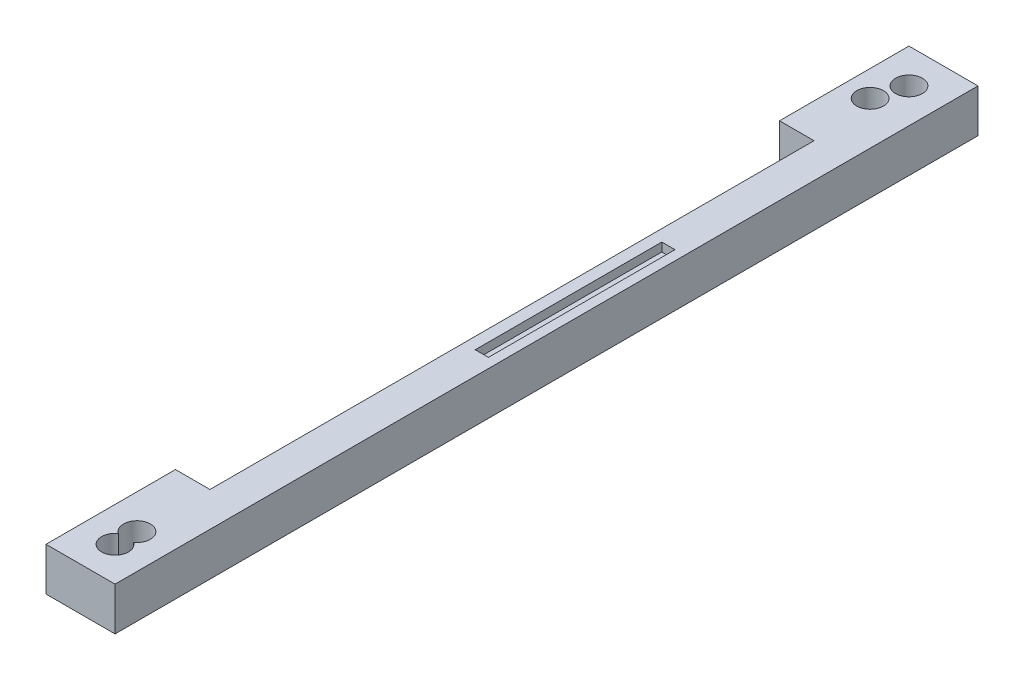
ISO-10303-21;
HEADER;
FILE_DESCRIPTION(('STEP AP214'),'2;1');
FILE_NAME('part.step','',(''),(''),'','','');
FILE_SCHEMA(('AUTOMOTIVE_DESIGN { 1 0 10303 214 1 1 1 1 }'));
ENDSEC;
DATA;
#1=APPLICATION_CONTEXT('core data for automotive mechanical design processes');
#2=APPLICATION_PROTOCOL_DEFINITION('international standard','automotive_design',2000,#1);
#3=PRODUCT_CONTEXT('',#1,'mechanical');
#4=PRODUCT('Part','Part','',(#3));
#5=PRODUCT_RELATED_PRODUCT_CATEGORY('part','',(#4));
#6=PRODUCT_DEFINITION_FORMATION('','',#4);
#7=PRODUCT_DEFINITION_CONTEXT('part definition',#1,'design');
#8=PRODUCT_DEFINITION('design','',#6,#7);
#9=PRODUCT_DEFINITION_SHAPE('','',#8);
#10=(LENGTH_UNIT() NAMED_UNIT(*) SI_UNIT(.MILLI.,.METRE.));
#11=(NAMED_UNIT(*) PLANE_ANGLE_UNIT() SI_UNIT($,.RADIAN.));
#12=(NAMED_UNIT(*) SI_UNIT($,.STERADIAN.) SOLID_ANGLE_UNIT());
#13=UNCERTAINTY_MEASURE_WITH_UNIT(LENGTH_MEASURE(1.E-05),#10,'distance_accuracy_value','');
#14=(GEOMETRIC_REPRESENTATION_CONTEXT(3) GLOBAL_UNCERTAINTY_ASSIGNED_CONTEXT((#13)) GLOBAL_UNIT_ASSIGNED_CONTEXT((#10,
#11,#12)) REPRESENTATION_CONTEXT('',''));
#15=CARTESIAN_POINT('',(0.,0.,0.));
#16=DIRECTION('',(0.,0.,1.));
#17=DIRECTION('',(1.,0.,0.));
#18=AXIS2_PLACEMENT_3D('',#15,#16,#17);
#19=CARTESIAN_POINT('',(-4.,5.,50.));
#20=DIRECTION('',(1.,0.,0.));
#21=DIRECTION('',(0.,0.,-1.));
#22=AXIS2_PLACEMENT_3D('',#19,#20,#21);
#23=PLANE('',#22);
#24=DIRECTION('',(0.,0.,1.));
#25=VECTOR('',#24,1.);
#26=CARTESIAN_POINT('',(-4.,0.,50.));
#27=LINE('',#26,#25);
#28=CARTESIAN_POINT('',(-4.,0.,-50.));
#29=VERTEX_POINT('',#28);
#30=CARTESIAN_POINT('',(-4.,0.,-35.));
#31=VERTEX_POINT('',#30);
#32=EDGE_CURVE('E269',#29,#31,#27,.T.);
#33=ORIENTED_EDGE('',*,*,#32,.T.);
#34=DIRECTION('',(0.,1.,0.));
#35=VECTOR('',#34,1.);
#36=CARTESIAN_POINT('',(-4.,0.,-35.));
#37=LINE('',#36,#35);
#38=CARTESIAN_POINT('',(-4.,5.,-35.));
#39=VERTEX_POINT('',#38);
#40=EDGE_CURVE('E206',#31,#39,#37,.T.);
#41=ORIENTED_EDGE('',*,*,#40,.T.);
#42=DIRECTION('',(0.,0.,1.));
#43=VECTOR('',#42,1.);
#44=CARTESIAN_POINT('',(-4.,5.,50.));
#45=LINE('',#44,#43);
#46=CARTESIAN_POINT('',(-4.,5.,-50.));
#47=VERTEX_POINT('',#46);
#48=EDGE_CURVE('E256',#47,#39,#45,.T.);
#49=ORIENTED_EDGE('',*,*,#48,.F.);
#50=DIRECTION('',(0.,-1.,0.));
#51=VECTOR('',#50,1.);
#52=CARTESIAN_POINT('',(-4.,5.,-50.));
#53=LINE('',#52,#51);
#54=EDGE_CURVE('E57',#47,#29,#53,.T.);
#55=ORIENTED_EDGE('',*,*,#54,.T.);
#56=EDGE_LOOP('',(#33,#41,#49,#55));
#57=FACE_BOUND('',#56,.T.);
#58=ADVANCED_FACE('F48',(#57),#23,.F.);
#59=CARTESIAN_POINT('',(4.,5.,50.));
#60=DIRECTION('',(-1.,0.,0.));
#61=DIRECTION('',(0.,0.,1.));
#62=AXIS2_PLACEMENT_3D('',#59,#60,#61);
#63=PLANE('',#62);
#64=DIRECTION('',(0.,0.,-1.));
#65=VECTOR('',#64,1.);
#66=CARTESIAN_POINT('',(4.,0.,50.));
#67=LINE('',#66,#65);
#68=CARTESIAN_POINT('',(4.,0.,50.));
#69=VERTEX_POINT('',#68);
#70=CARTESIAN_POINT('',(4.,0.,-50.));
#71=VERTEX_POINT('',#70);
#72=EDGE_CURVE('E244',#69,#71,#67,.T.);
#73=ORIENTED_EDGE('',*,*,#72,.T.);
#74=DIRECTION('',(0.,-1.,0.));
#75=VECTOR('',#74,1.);
#76=CARTESIAN_POINT('',(4.,5.,-50.));
#77=LINE('',#76,#75);
#78=CARTESIAN_POINT('',(4.,5.,-50.));
#79=VERTEX_POINT('',#78);
#80=EDGE_CURVE('E12',#79,#71,#77,.T.);
#81=ORIENTED_EDGE('',*,*,#80,.F.);
#82=DIRECTION('',(0.,0.,-1.));
#83=VECTOR('',#82,1.);
#84=CARTESIAN_POINT('',(4.,5.,50.));
#85=LINE('',#84,#83);
#86=CARTESIAN_POINT('',(4.,5.,50.));
#87=VERTEX_POINT('',#86);
#88=EDGE_CURVE('E247',#87,#79,#85,.T.);
#89=ORIENTED_EDGE('',*,*,#88,.F.);
#90=DIRECTION('',(0.,-1.,0.));
#91=VECTOR('',#90,1.);
#92=CARTESIAN_POINT('',(4.,5.,50.));
#93=LINE('',#92,#91);
#94=EDGE_CURVE('E261',#87,#69,#93,.T.);
#95=ORIENTED_EDGE('',*,*,#94,.T.);
#96=EDGE_LOOP('',(#73,#81,#89,#95));
#97=FACE_BOUND('',#96,.T.);
#98=ADVANCED_FACE('F50',(#97),#63,.F.);
#99=CARTESIAN_POINT('',(-4.,5.,-50.));
#100=DIRECTION('',(0.,0.,1.));
#101=DIRECTION('',(1.,0.,0.));
#102=AXIS2_PLACEMENT_3D('',#99,#100,#101);
#103=PLANE('',#102);
#104=DIRECTION('',(-1.,0.,0.));
#105=VECTOR('',#104,1.);
#106=CARTESIAN_POINT('',(-4.,0.,-50.));
#107=LINE('',#106,#105);
#108=EDGE_CURVE('E265',#71,#29,#107,.T.);
#109=ORIENTED_EDGE('',*,*,#108,.T.);
#110=ORIENTED_EDGE('',*,*,#54,.F.);
#111=DIRECTION('',(-1.,0.,0.));
#112=VECTOR('',#111,1.);
#113=CARTESIAN_POINT('',(-4.,5.,-50.));
#114=LINE('',#113,#112);
#115=EDGE_CURVE('E251',#79,#47,#114,.T.);
#116=ORIENTED_EDGE('',*,*,#115,.F.);
#117=ORIENTED_EDGE('',*,*,#80,.T.);
#118=EDGE_LOOP('',(#109,#110,#116,#117));
#119=FACE_BOUND('',#118,.T.);
#120=ADVANCED_FACE('F296',(#119),#103,.F.);
#121=CARTESIAN_POINT('',(-3.99999999999999,5.,35.));
#122=VERTEX_POINT('',#121);
#123=CARTESIAN_POINT('',(-4.,5.,50.));
#124=VERTEX_POINT('',#123);
#125=EDGE_CURVE('E255',#122,#124,#45,.T.);
#126=ORIENTED_EDGE('',*,*,#125,.F.);
#127=DIRECTION('',(0.,1.,0.));
#128=VECTOR('',#127,1.);
#129=CARTESIAN_POINT('',(-3.99999999999999,0.,35.));
#130=LINE('',#129,#128);
#131=CARTESIAN_POINT('',(-3.99999999999999,0.,35.));
#132=VERTEX_POINT('',#131);
#133=EDGE_CURVE('E199',#132,#122,#130,.T.);
#134=ORIENTED_EDGE('',*,*,#133,.F.);
#135=CARTESIAN_POINT('',(-4.,0.,50.));
#136=VERTEX_POINT('',#135);
#137=EDGE_CURVE('E268',#132,#136,#27,.T.);
#138=ORIENTED_EDGE('',*,*,#137,.T.);
#139=DIRECTION('',(0.,-1.,0.));
#140=VECTOR('',#139,1.);
#141=CARTESIAN_POINT('',(-4.,5.,50.));
#142=LINE('',#141,#140);
#143=EDGE_CURVE('E275',#124,#136,#142,.T.);
#144=ORIENTED_EDGE('',*,*,#143,.F.);
#145=EDGE_LOOP('',(#126,#134,#138,#144));
#146=FACE_BOUND('',#145,.T.);
#147=ADVANCED_FACE('F307',(#146),#23,.F.);
#148=CARTESIAN_POINT('',(-4.,5.,50.));
#149=DIRECTION('',(0.,0.,-1.));
#150=DIRECTION('',(-1.,0.,0.));
#151=AXIS2_PLACEMENT_3D('',#148,#149,#150);
#152=PLANE('',#151);
#153=DIRECTION('',(1.,0.,0.));
#154=VECTOR('',#153,1.);
#155=CARTESIAN_POINT('',(-4.,0.,50.));
#156=LINE('',#155,#154);
#157=EDGE_CURVE('E252',#136,#69,#156,.T.);
#158=ORIENTED_EDGE('',*,*,#157,.T.);
#159=ORIENTED_EDGE('',*,*,#94,.F.);
#160=DIRECTION('',(1.,0.,0.));
#161=VECTOR('',#160,1.);
#162=CARTESIAN_POINT('',(-4.,5.,50.));
#163=LINE('',#162,#161);
#164=EDGE_CURVE('E259',#124,#87,#163,.T.);
#165=ORIENTED_EDGE('',*,*,#164,.F.);
#166=ORIENTED_EDGE('',*,*,#143,.T.);
#167=EDGE_LOOP('',(#158,#159,#165,#166));
#168=FACE_BOUND('',#167,.T.);
#169=ADVANCED_FACE('F302',(#168),#152,.F.);
#170=CARTESIAN_POINT('',(0.,5.,0.));
#171=DIRECTION('',(0.,-1.,0.));
#172=DIRECTION('',(0.,0.,-1.));
#173=AXIS2_PLACEMENT_3D('',#170,#171,#172);
#174=PLANE('',#173);
#175=DIRECTION('',(-1.,0.,0.));
#176=VECTOR('',#175,1.);
#177=CARTESIAN_POINT('',(2.87787692469349,5.,-16.0106361223445));
#178=LINE('',#177,#176);
#179=CARTESIAN_POINT('',(2.87787692469349,5.,-16.0106361223445));
#180=VERTEX_POINT('',#179);
#181=CARTESIAN_POINT('',(1.3473605670065,5.,-16.0106361223445));
#182=VERTEX_POINT('',#181);
#183=EDGE_CURVE('E181',#180,#182,#178,.T.);
#184=ORIENTED_EDGE('',*,*,#183,.F.);
#185=DIRECTION('',(0.,0.,-1.));
#186=VECTOR('',#185,1.);
#187=CARTESIAN_POINT('',(2.87787692469349,5.,5.60790742998434));
#188=LINE('',#187,#186);
#189=CARTESIAN_POINT('',(2.87787692469349,5.,5.60790742998434));
#190=VERTEX_POINT('',#189);
#191=EDGE_CURVE('E64',#190,#180,#188,.T.);
#192=ORIENTED_EDGE('',*,*,#191,.F.);
#193=DIRECTION('',(1.,0.,0.));
#194=VECTOR('',#193,1.);
#195=CARTESIAN_POINT('',(2.87787692469349,5.,5.60790742998434));
#196=LINE('',#195,#194);
#197=CARTESIAN_POINT('',(1.3473605670065,5.,5.60790742998434));
#198=VERTEX_POINT('',#197);
#199=EDGE_CURVE('E172',#198,#190,#196,.T.);
#200=ORIENTED_EDGE('',*,*,#199,.F.);
#201=DIRECTION('',(0.,0.,1.));
#202=VECTOR('',#201,1.);
#203=CARTESIAN_POINT('',(1.3473605670065,5.,5.60790742998434));
#204=LINE('',#203,#202);
#205=EDGE_CURVE('E175',#182,#198,#204,.T.);
#206=ORIENTED_EDGE('',*,*,#205,.F.);
#207=EDGE_LOOP('',(#184,#192,#200,#206));
#208=FACE_BOUND('',#207,.T.);
#209=CARTESIAN_POINT('',(0.,5.,-46.));
#210=DIRECTION('',(0.,1.,0.));
#211=DIRECTION('',(0.,0.,1.));
#212=AXIS2_PLACEMENT_3D('',#209,#210,#211);
#213=CIRCLE('',#212,1.55);
#214=CARTESIAN_POINT('',(0.,5.,-44.45));
#215=VERTEX_POINT('',#214);
#216=EDGE_CURVE('E220',#215,#215,#213,.T.);
#217=ORIENTED_EDGE('',*,*,#216,.F.);
#218=EDGE_LOOP('',(#217));
#219=FACE_BOUND('',#218,.T.);
#220=CARTESIAN_POINT('',(-1.,5.,-42.5));
#221=DIRECTION('',(0.,1.,0.));
#222=DIRECTION('',(0.,0.,1.));
#223=AXIS2_PLACEMENT_3D('',#220,#221,#222);
#224=CIRCLE('',#223,1.55);
#225=CARTESIAN_POINT('',(-1.,5.,-40.95));
#226=VERTEX_POINT('',#225);
#227=EDGE_CURVE('E224',#226,#226,#224,.T.);
#228=ORIENTED_EDGE('',*,*,#227,.F.);
#229=EDGE_LOOP('',(#228));
#230=FACE_BOUND('',#229,.T.);
#231=CARTESIAN_POINT('',(0.,5.,46.));
#232=DIRECTION('',(0.,1.,0.));
#233=DIRECTION('',(0.,0.,1.));
#234=AXIS2_PLACEMENT_3D('',#231,#232,#233);
#235=CIRCLE('',#234,1.55);
#236=CARTESIAN_POINT('',(-0.888594395660923,5.,44.73));
#237=VERTEX_POINT('',#236);
#238=CARTESIAN_POINT('',(0.888594395660923,5.,44.73));
#239=VERTEX_POINT('',#238);
#240=EDGE_CURVE('E219',#237,#239,#235,.T.);
#241=ORIENTED_EDGE('',*,*,#240,.F.);
#242=CARTESIAN_POINT('',(0.,5.,43.4600000000001));
#243=DIRECTION('',(0.,1.,0.));
#244=DIRECTION('',(0.,0.,1.));
#245=AXIS2_PLACEMENT_3D('',#242,#243,#244);
#246=CIRCLE('',#245,1.55);
#247=EDGE_CURVE('E232',#239,#237,#246,.T.);
#248=ORIENTED_EDGE('',*,*,#247,.F.);
#249=EDGE_LOOP('',(#241,#248));
#250=FACE_BOUND('',#249,.T.);
#251=ORIENTED_EDGE('',*,*,#48,.T.);
#252=DIRECTION('',(-1.,0.,0.));
#253=VECTOR('',#252,1.);
#254=CARTESIAN_POINT('',(-4.,5.,-35.));
#255=LINE('',#254,#253);
#256=CARTESIAN_POINT('',(0.,5.,-35.));
#257=VERTEX_POINT('',#256);
#258=EDGE_CURVE('E194',#257,#39,#255,.T.);
#259=ORIENTED_EDGE('',*,*,#258,.F.);
#260=DIRECTION('',(0.,0.,-1.));
#261=VECTOR('',#260,1.);
#262=CARTESIAN_POINT('',(0.,5.,-35.));
#263=LINE('',#262,#261);
#264=CARTESIAN_POINT('',(0.,5.,35.));
#265=VERTEX_POINT('',#264);
#266=EDGE_CURVE('E202',#265,#257,#263,.T.);
#267=ORIENTED_EDGE('',*,*,#266,.F.);
#268=DIRECTION('',(1.,0.,0.));
#269=VECTOR('',#268,1.);
#270=CARTESIAN_POINT('',(-3.99999999999999,5.,35.));
#271=LINE('',#270,#269);
#272=EDGE_CURVE('E187',#122,#265,#271,.T.);
#273=ORIENTED_EDGE('',*,*,#272,.F.);
#274=ORIENTED_EDGE('',*,*,#125,.T.);
#275=ORIENTED_EDGE('',*,*,#164,.T.);
#276=ORIENTED_EDGE('',*,*,#88,.T.);
#277=ORIENTED_EDGE('',*,*,#115,.T.);
#278=EDGE_LOOP('',(#251,#259,#267,#273,#274,#275,#276,#277));
#279=FACE_BOUND('',#278,.T.);
#280=ADVANCED_FACE('F292',(#208,#219,#230,#250,#279),#174,.F.);
#281=CARTESIAN_POINT('',(0.,0.,0.));
#282=DIRECTION('',(0.,-1.,0.));
#283=DIRECTION('',(0.,0.,-1.));
#284=AXIS2_PLACEMENT_3D('',#281,#282,#283);
#285=PLANE('',#284);
#286=DIRECTION('',(-1.,0.,0.));
#287=VECTOR('',#286,1.);
#288=CARTESIAN_POINT('',(-4.,0.,-35.));
#289=LINE('',#288,#287);
#290=CARTESIAN_POINT('',(0.,0.,-35.));
#291=VERTEX_POINT('',#290);
#292=EDGE_CURVE('E196',#291,#31,#289,.T.);
#293=ORIENTED_EDGE('',*,*,#292,.T.);
#294=ORIENTED_EDGE('',*,*,#32,.F.);
#295=ORIENTED_EDGE('',*,*,#108,.F.);
#296=ORIENTED_EDGE('',*,*,#72,.F.);
#297=ORIENTED_EDGE('',*,*,#157,.F.);
#298=ORIENTED_EDGE('',*,*,#137,.F.);
#299=DIRECTION('',(1.,0.,0.));
#300=VECTOR('',#299,1.);
#301=CARTESIAN_POINT('',(-3.99999999999999,0.,35.));
#302=LINE('',#301,#300);
#303=CARTESIAN_POINT('',(0.,0.,35.));
#304=VERTEX_POINT('',#303);
#305=EDGE_CURVE('E191',#132,#304,#302,.T.);
#306=ORIENTED_EDGE('',*,*,#305,.T.);
#307=DIRECTION('',(0.,0.,-1.));
#308=VECTOR('',#307,1.);
#309=CARTESIAN_POINT('',(0.,0.,-35.));
#310=LINE('',#309,#308);
#311=EDGE_CURVE('E72',#304,#291,#310,.T.);
#312=ORIENTED_EDGE('',*,*,#311,.T.);
#313=EDGE_LOOP('',(#293,#294,#295,#296,#297,#298,#306,#312));
#314=FACE_BOUND('',#313,.T.);
#315=CARTESIAN_POINT('',(0.,0.,-46.));
#316=DIRECTION('',(0.,1.,0.));
#317=DIRECTION('',(0.,0.,1.));
#318=AXIS2_PLACEMENT_3D('',#315,#316,#317);
#319=CIRCLE('',#318,1.55);
#320=CARTESIAN_POINT('',(0.,0.,-44.45));
#321=VERTEX_POINT('',#320);
#322=EDGE_CURVE('E215',#321,#321,#319,.T.);
#323=ORIENTED_EDGE('',*,*,#322,.T.);
#324=EDGE_LOOP('',(#323));
#325=FACE_BOUND('',#324,.T.);
#326=CARTESIAN_POINT('',(-1.,0.,-42.5));
#327=DIRECTION('',(0.,1.,0.));
#328=DIRECTION('',(0.,0.,1.));
#329=AXIS2_PLACEMENT_3D('',#326,#327,#328);
#330=CIRCLE('',#329,1.55);
#331=CARTESIAN_POINT('',(-1.,0.,-40.95));
#332=VERTEX_POINT('',#331);
#333=EDGE_CURVE('E228',#332,#332,#330,.T.);
#334=ORIENTED_EDGE('',*,*,#333,.T.);
#335=EDGE_LOOP('',(#334));
#336=FACE_BOUND('',#335,.T.);
#337=CARTESIAN_POINT('',(0.,0.,43.4600000000001));
#338=DIRECTION('',(0.,1.,0.));
#339=DIRECTION('',(0.,0.,1.));
#340=AXIS2_PLACEMENT_3D('',#337,#338,#339);
#341=CIRCLE('',#340,1.55);
#342=CARTESIAN_POINT('',(0.888594395660924,0.,44.73));
#343=VERTEX_POINT('',#342);
#344=CARTESIAN_POINT('',(-0.888594395660923,0.,44.73));
#345=VERTEX_POINT('',#344);
#346=EDGE_CURVE('E234',#343,#345,#341,.T.);
#347=ORIENTED_EDGE('',*,*,#346,.T.);
#348=CARTESIAN_POINT('',(0.,0.,46.));
#349=DIRECTION('',(0.,1.,0.));
#350=DIRECTION('',(0.,0.,1.));
#351=AXIS2_PLACEMENT_3D('',#348,#349,#350);
#352=CIRCLE('',#351,1.55);
#353=EDGE_CURVE('E241',#345,#343,#352,.T.);
#354=ORIENTED_EDGE('',*,*,#353,.T.);
#355=EDGE_LOOP('',(#347,#354));
#356=FACE_BOUND('',#355,.T.);
#357=ADVANCED_FACE('F284',(#314,#325,#336,#356),#285,.T.);
#358=CARTESIAN_POINT('',(0.,0.,46.));
#359=DIRECTION('',(0.,1.,0.));
#360=DIRECTION('',(0.,0.,1.));
#361=AXIS2_PLACEMENT_3D('',#358,#359,#360);
#362=CYLINDRICAL_SURFACE('',#361,1.55);
#363=ORIENTED_EDGE('',*,*,#353,.F.);
#364=DIRECTION('',(0.,1.,0.));
#365=VECTOR('',#364,1.);
#366=CARTESIAN_POINT('',(-0.888594395660923,0.,44.73));
#367=LINE('',#366,#365);
#368=EDGE_CURVE('E237',#345,#237,#367,.T.);
#369=ORIENTED_EDGE('',*,*,#368,.T.);
#370=ORIENTED_EDGE('',*,*,#240,.T.);
#371=DIRECTION('',(0.,1.,0.));
#372=VECTOR('',#371,1.);
#373=CARTESIAN_POINT('',(0.888594395660923,0.,44.73));
#374=LINE('',#373,#372);
#375=EDGE_CURVE('E209',#343,#239,#374,.T.);
#376=ORIENTED_EDGE('',*,*,#375,.F.);
#377=EDGE_LOOP('',(#363,#369,#370,#376));
#378=FACE_BOUND('',#377,.T.);
#379=ADVANCED_FACE('F372',(#378),#362,.F.);
#380=CARTESIAN_POINT('',(0.,0.,43.4600000000001));
#381=DIRECTION('',(0.,1.,0.));
#382=DIRECTION('',(0.,0.,1.));
#383=AXIS2_PLACEMENT_3D('',#380,#381,#382);
#384=CYLINDRICAL_SURFACE('',#383,1.55);
#385=ORIENTED_EDGE('',*,*,#368,.F.);
#386=ORIENTED_EDGE('',*,*,#346,.F.);
#387=ORIENTED_EDGE('',*,*,#375,.T.);
#388=ORIENTED_EDGE('',*,*,#247,.T.);
#389=EDGE_LOOP('',(#385,#386,#387,#388));
#390=FACE_BOUND('',#389,.T.);
#391=ADVANCED_FACE('F381',(#390),#384,.F.);
#392=CARTESIAN_POINT('',(-1.,0.,-42.5));
#393=DIRECTION('',(0.,1.,0.));
#394=DIRECTION('',(0.,0.,1.));
#395=AXIS2_PLACEMENT_3D('',#392,#393,#394);
#396=CYLINDRICAL_SURFACE('',#395,1.55);
#397=ORIENTED_EDGE('',*,*,#333,.F.);
#398=EDGE_LOOP('',(#397));
#399=FACE_BOUND('',#398,.T.);
#400=ORIENTED_EDGE('',*,*,#227,.T.);
#401=EDGE_LOOP('',(#400));
#402=FACE_BOUND('',#401,.T.);
#403=ADVANCED_FACE('F390',(#399,#402),#396,.F.);
#404=CARTESIAN_POINT('',(0.,0.,-46.));
#405=DIRECTION('',(0.,1.,0.));
#406=DIRECTION('',(0.,0.,1.));
#407=AXIS2_PLACEMENT_3D('',#404,#405,#406);
#408=CYLINDRICAL_SURFACE('',#407,1.55);
#409=ORIENTED_EDGE('',*,*,#322,.F.);
#410=EDGE_LOOP('',(#409));
#411=FACE_BOUND('',#410,.T.);
#412=ORIENTED_EDGE('',*,*,#216,.T.);
#413=EDGE_LOOP('',(#412));
#414=FACE_BOUND('',#413,.T.);
#415=ADVANCED_FACE('F320',(#411,#414),#408,.F.);
#416=CARTESIAN_POINT('',(-4.,0.,-35.));
#417=DIRECTION('',(0.,0.,-1.));
#418=DIRECTION('',(-1.,0.,0.));
#419=AXIS2_PLACEMENT_3D('',#416,#417,#418);
#420=PLANE('',#419);
#421=ORIENTED_EDGE('',*,*,#258,.T.);
#422=ORIENTED_EDGE('',*,*,#40,.F.);
#423=ORIENTED_EDGE('',*,*,#292,.F.);
#424=DIRECTION('',(0.,1.,0.));
#425=VECTOR('',#424,1.);
#426=CARTESIAN_POINT('',(0.,0.,-35.));
#427=LINE('',#426,#425);
#428=EDGE_CURVE('E210',#291,#257,#427,.T.);
#429=ORIENTED_EDGE('',*,*,#428,.T.);
#430=EDGE_LOOP('',(#421,#422,#423,#429));
#431=FACE_BOUND('',#430,.T.);
#432=ADVANCED_FACE('F289',(#431),#420,.F.);
#433=CARTESIAN_POINT('',(0.,0.,-35.));
#434=DIRECTION('',(1.,0.,0.));
#435=DIRECTION('',(0.,0.,-1.));
#436=AXIS2_PLACEMENT_3D('',#433,#434,#435);
#437=PLANE('',#436);
#438=ORIENTED_EDGE('',*,*,#266,.T.);
#439=ORIENTED_EDGE('',*,*,#428,.F.);
#440=ORIENTED_EDGE('',*,*,#311,.F.);
#441=DIRECTION('',(0.,1.,0.));
#442=VECTOR('',#441,1.);
#443=CARTESIAN_POINT('',(0.,0.,35.));
#444=LINE('',#443,#442);
#445=EDGE_CURVE('E212',#304,#265,#444,.T.);
#446=ORIENTED_EDGE('',*,*,#445,.T.);
#447=EDGE_LOOP('',(#438,#439,#440,#446));
#448=FACE_BOUND('',#447,.T.);
#449=ADVANCED_FACE('F312',(#448),#437,.F.);
#450=CARTESIAN_POINT('',(-3.99999999999999,0.,35.));
#451=DIRECTION('',(0.,0.,1.));
#452=DIRECTION('',(1.,0.,0.));
#453=AXIS2_PLACEMENT_3D('',#450,#451,#452);
#454=PLANE('',#453);
#455=ORIENTED_EDGE('',*,*,#272,.T.);
#456=ORIENTED_EDGE('',*,*,#445,.F.);
#457=ORIENTED_EDGE('',*,*,#305,.F.);
#458=ORIENTED_EDGE('',*,*,#133,.T.);
#459=EDGE_LOOP('',(#455,#456,#457,#458));
#460=FACE_BOUND('',#459,.T.);
#461=ADVANCED_FACE('F311',(#460),#454,.F.);
#462=CARTESIAN_POINT('',(2.87787692469349,4.,5.60790742998434));
#463=DIRECTION('',(1.,0.,0.));
#464=DIRECTION('',(0.,0.,-1.));
#465=AXIS2_PLACEMENT_3D('',#462,#463,#464);
#466=PLANE('',#465);
#467=ORIENTED_EDGE('',*,*,#191,.T.);
#468=DIRECTION('',(0.,1.,0.));
#469=VECTOR('',#468,1.);
#470=CARTESIAN_POINT('',(2.87787692469349,4.,-16.0106361223445));
#471=LINE('',#470,#469);
#472=CARTESIAN_POINT('',(2.87787692469349,4.,-16.0106361223445));
#473=VERTEX_POINT('',#472);
#474=EDGE_CURVE('E150',#473,#180,#471,.T.);
#475=ORIENTED_EDGE('',*,*,#474,.F.);
#476=DIRECTION('',(0.,0.,-1.));
#477=VECTOR('',#476,1.);
#478=CARTESIAN_POINT('',(2.87787692469349,4.,5.60790742998434));
#479=LINE('',#478,#477);
#480=CARTESIAN_POINT('',(2.87787692469349,4.,5.60790742998434));
#481=VERTEX_POINT('',#480);
#482=EDGE_CURVE('E154',#481,#473,#479,.T.);
#483=ORIENTED_EDGE('',*,*,#482,.F.);
#484=DIRECTION('',(0.,1.,0.));
#485=VECTOR('',#484,1.);
#486=CARTESIAN_POINT('',(2.87787692469349,4.,5.60790742998434));
#487=LINE('',#486,#485);
#488=EDGE_CURVE('E185',#481,#190,#487,.T.);
#489=ORIENTED_EDGE('',*,*,#488,.T.);
#490=EDGE_LOOP('',(#467,#475,#483,#489));
#491=FACE_BOUND('',#490,.T.);
#492=ADVANCED_FACE('F152',(#491),#466,.F.);
#493=CARTESIAN_POINT('',(2.87787692469349,4.,5.60790742998434));
#494=DIRECTION('',(0.,0.,1.));
#495=DIRECTION('',(1.,0.,0.));
#496=AXIS2_PLACEMENT_3D('',#493,#494,#495);
#497=PLANE('',#496);
#498=ORIENTED_EDGE('',*,*,#199,.T.);
#499=ORIENTED_EDGE('',*,*,#488,.F.);
#500=DIRECTION('',(1.,0.,0.));
#501=VECTOR('',#500,1.);
#502=CARTESIAN_POINT('',(2.87787692469349,4.,5.60790742998434));
#503=LINE('',#502,#501);
#504=CARTESIAN_POINT('',(1.3473605670065,4.,5.60790742998434));
#505=VERTEX_POINT('',#504);
#506=EDGE_CURVE('E160',#505,#481,#503,.T.);
#507=ORIENTED_EDGE('',*,*,#506,.F.);
#508=DIRECTION('',(0.,1.,0.));
#509=VECTOR('',#508,1.);
#510=CARTESIAN_POINT('',(1.3473605670065,4.,5.60790742998434));
#511=LINE('',#510,#509);
#512=EDGE_CURVE('E188',#505,#198,#511,.T.);
#513=ORIENTED_EDGE('',*,*,#512,.T.);
#514=EDGE_LOOP('',(#498,#499,#507,#513));
#515=FACE_BOUND('',#514,.T.);
#516=ADVANCED_FACE('F430',(#515),#497,.F.);
#517=CARTESIAN_POINT('',(1.3473605670065,4.,5.60790742998434));
#518=DIRECTION('',(-1.,0.,0.));
#519=DIRECTION('',(0.,0.,1.));
#520=AXIS2_PLACEMENT_3D('',#517,#518,#519);
#521=PLANE('',#520);
#522=ORIENTED_EDGE('',*,*,#205,.T.);
#523=ORIENTED_EDGE('',*,*,#512,.F.);
#524=DIRECTION('',(0.,0.,1.));
#525=VECTOR('',#524,1.);
#526=CARTESIAN_POINT('',(1.3473605670065,4.,5.60790742998434));
#527=LINE('',#526,#525);
#528=CARTESIAN_POINT('',(1.3473605670065,4.,-16.0106361223445));
#529=VERTEX_POINT('',#528);
#530=EDGE_CURVE('E168',#529,#505,#527,.T.);
#531=ORIENTED_EDGE('',*,*,#530,.F.);
#532=DIRECTION('',(0.,1.,0.));
#533=VECTOR('',#532,1.);
#534=CARTESIAN_POINT('',(1.3473605670065,4.,-16.0106361223445));
#535=LINE('',#534,#533);
#536=EDGE_CURVE('E159',#529,#182,#535,.T.);
#537=ORIENTED_EDGE('',*,*,#536,.T.);
#538=EDGE_LOOP('',(#522,#523,#531,#537));
#539=FACE_BOUND('',#538,.T.);
#540=ADVANCED_FACE('F438',(#539),#521,.F.);
#541=CARTESIAN_POINT('',(2.87787692469349,4.,-16.0106361223445));
#542=DIRECTION('',(0.,0.,-1.));
#543=DIRECTION('',(-1.,0.,0.));
#544=AXIS2_PLACEMENT_3D('',#541,#542,#543);
#545=PLANE('',#544);
#546=ORIENTED_EDGE('',*,*,#183,.T.);
#547=ORIENTED_EDGE('',*,*,#536,.F.);
#548=DIRECTION('',(-1.,0.,0.));
#549=VECTOR('',#548,1.);
#550=CARTESIAN_POINT('',(2.87787692469349,4.,-16.0106361223445));
#551=LINE('',#550,#549);
#552=EDGE_CURVE('E163',#473,#529,#551,.T.);
#553=ORIENTED_EDGE('',*,*,#552,.F.);
#554=ORIENTED_EDGE('',*,*,#474,.T.);
#555=EDGE_LOOP('',(#546,#547,#553,#554));
#556=FACE_BOUND('',#555,.T.);
#557=ADVANCED_FACE('F164',(#556),#545,.F.);
#558=CARTESIAN_POINT('',(0.,4.,0.));
#559=DIRECTION('',(0.,1.,0.));
#560=DIRECTION('',(0.,0.,1.));
#561=AXIS2_PLACEMENT_3D('',#558,#559,#560);
#562=PLANE('',#561);
#563=ORIENTED_EDGE('',*,*,#482,.T.);
#564=ORIENTED_EDGE('',*,*,#552,.T.);
#565=ORIENTED_EDGE('',*,*,#530,.T.);
#566=ORIENTED_EDGE('',*,*,#506,.T.);
#567=EDGE_LOOP('',(#563,#564,#565,#566));
#568=FACE_BOUND('',#567,.T.);
#569=ADVANCED_FACE('F170',(#568),#562,.T.);
#570=CLOSED_SHELL('',(#58,#98,#120,#147,#169,#280,#357,#379,#391,#403,#415,#432,#449,#461,#492,
#516,#540,#557,#569));
#571=MANIFOLD_SOLID_BREP('B2',#570);
#572=ADVANCED_BREP_SHAPE_REPRESENTATION('',(#18,#571),#14);
#573=SHAPE_DEFINITION_REPRESENTATION(#9,#572);
ENDSEC;
END-ISO-10303-21;
